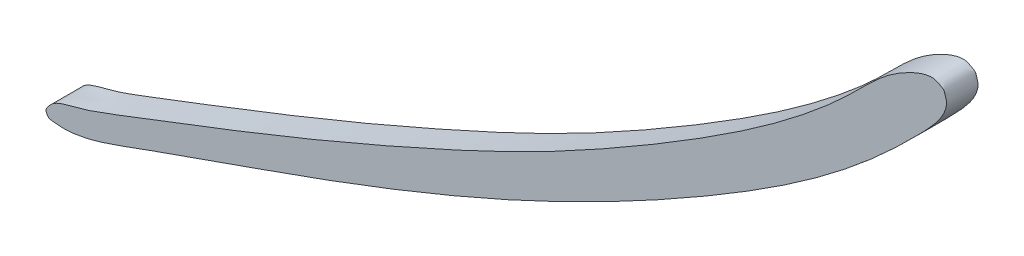
ISO-10303-21;
HEADER;
FILE_DESCRIPTION(('STEP AP214'),'2;1');
FILE_NAME('part.step','',(''),(''),'','','');
FILE_SCHEMA(('AUTOMOTIVE_DESIGN { 1 0 10303 214 1 1 1 1 }'));
ENDSEC;
DATA;
#1=APPLICATION_CONTEXT('core data for automotive mechanical design processes');
#2=APPLICATION_PROTOCOL_DEFINITION('international standard','automotive_design',2000,#1);
#3=PRODUCT_CONTEXT('',#1,'mechanical');
#4=PRODUCT('Part','Part','',(#3));
#5=PRODUCT_RELATED_PRODUCT_CATEGORY('part','',(#4));
#6=PRODUCT_DEFINITION_FORMATION('','',#4);
#7=PRODUCT_DEFINITION_CONTEXT('part definition',#1,'design');
#8=PRODUCT_DEFINITION('design','',#6,#7);
#9=PRODUCT_DEFINITION_SHAPE('','',#8);
#10=(LENGTH_UNIT() NAMED_UNIT(*) SI_UNIT(.MILLI.,.METRE.));
#11=(NAMED_UNIT(*) PLANE_ANGLE_UNIT() SI_UNIT($,.RADIAN.));
#12=(NAMED_UNIT(*) SI_UNIT($,.STERADIAN.) SOLID_ANGLE_UNIT());
#13=UNCERTAINTY_MEASURE_WITH_UNIT(LENGTH_MEASURE(1.E-05),#10,'distance_accuracy_value','');
#14=(GEOMETRIC_REPRESENTATION_CONTEXT(3) GLOBAL_UNCERTAINTY_ASSIGNED_CONTEXT((#13)) GLOBAL_UNIT_ASSIGNED_CONTEXT((#10,
#11,#12)) REPRESENTATION_CONTEXT('',''));
#15=CARTESIAN_POINT('',(0.,0.,0.));
#16=DIRECTION('',(0.,0.,1.));
#17=DIRECTION('',(1.,0.,0.));
#18=AXIS2_PLACEMENT_3D('',#15,#16,#17);
#19=CARTESIAN_POINT('',(102.137930455402,0.,132.));
#20=CARTESIAN_POINT('',(102.037805146897,0.146229636871609,132.));
#21=CARTESIAN_POINT('',(101.890978832327,0.245399337889206,132.));
#22=CARTESIAN_POINT('',(101.591842363803,0.426321827671628,132.));
#23=CARTESIAN_POINT('',(101.436906964679,0.507239635619079,132.));
#24=CARTESIAN_POINT('',(101.131169709521,0.676425166947434,132.));
#25=CARTESIAN_POINT('',(100.979729814353,0.763558383299158,132.));
#26=CARTESIAN_POINT('',(100.670191526747,0.925985241393696,132.));
#27=CARTESIAN_POINT('',(100.512659050345,1.00156543279865,132.));
#28=CARTESIAN_POINT('',(100.19279169691,1.13596357788684,132.));
#29=CARTESIAN_POINT('',(100.029964221238,1.19440802386454,132.));
#30=CARTESIAN_POINT('',(99.6938321131069,1.27960031332769,132.));
#31=CARTESIAN_POINT('',(99.5192867482493,1.30751595835844,132.));
#32=CARTESIAN_POINT('',(98.9952017038134,1.35163922315983,132.));
#33=CARTESIAN_POINT('',(98.6488621361716,1.32995636890433,132.));
#34=CARTESIAN_POINT('',(97.9591578152379,1.23675947162597,132.));
#35=CARTESIAN_POINT('',(97.6156420688588,1.16357030800946,132.));
#36=CARTESIAN_POINT('',(96.9424250187698,0.993989515733939,132.));
#37=CARTESIAN_POINT('',(96.6107898330607,0.896004925311457,132.));
#38=CARTESIAN_POINT('',(95.629072418065,0.567063211778538,132.));
#39=CARTESIAN_POINT('',(94.9909595162237,0.304351643391276,132.));
#40=CARTESIAN_POINT('',(93.730224157236,-0.262167409642695,132.));
#41=CARTESIAN_POINT('',(93.1069309204403,-0.5700460146506,132.));
#42=CARTESIAN_POINT('',(91.8862772052124,-1.22155197350918,132.));
#43=CARTESIAN_POINT('',(91.288815308498,-1.56439449434345,132.));
#44=CARTESIAN_POINT('',(89.5323168720474,-2.64059392407347,132.));
#45=CARTESIAN_POINT('',(88.4111674647103,-3.42427929668611,132.));
#46=CARTESIAN_POINT('',(85.1905606883966,-5.96508296367269,132.));
#47=CARTESIAN_POINT('',(83.2196758821644,-7.89327988453794,132.));
#48=CARTESIAN_POINT('',(80.2816227209656,-10.8086102894227,132.));
#49=CARTESIAN_POINT('',(79.303536538693,-11.7820292721773,132.));
#50=CARTESIAN_POINT('',(77.3272504792528,-13.7027536513072,132.));
#51=CARTESIAN_POINT('',(76.3308315382405,-14.652371234994,132.));
#52=CARTESIAN_POINT('',(73.2979908044276,-17.4446390460552,132.));
#53=CARTESIAN_POINT('',(71.2207642869302,-19.2343125474414,132.));
#54=CARTESIAN_POINT('',(66.9941575476802,-22.719982481008,132.));
#55=CARTESIAN_POINT('',(64.8447463862334,-24.41593874422,132.));
#56=CARTESIAN_POINT('',(60.4924070989655,-27.738370258863,132.));
#57=CARTESIAN_POINT('',(58.2875916053236,-29.3623951428766,132.));
#58=CARTESIAN_POINT('',(53.8221644956033,-32.5380048708967,132.));
#59=CARTESIAN_POINT('',(51.5624798228858,-34.0907931643764,132.));
#60=CARTESIAN_POINT('',(47.0011353790986,-37.1418735306101,132.));
#61=CARTESIAN_POINT('',(44.6996645082014,-38.6404108522355,132.));
#62=CARTESIAN_POINT('',(40.0665419953837,-41.5983018360331,132.));
#63=CARTESIAN_POINT('',(37.7336982495932,-43.0574486570299,132.));
#64=CARTESIAN_POINT('',(30.7020287301212,-47.3800485668496,132.));
#65=CARTESIAN_POINT('',(25.9692023930995,-50.1888838849351,132.));
#66=CARTESIAN_POINT('',(16.4352471657119,-55.6836967105463,132.));
#67=CARTESIAN_POINT('',(11.6337757960862,-58.3688620870521,132.));
#68=CARTESIAN_POINT('',(1.93825840451001,-63.5721497871928,132.));
#69=CARTESIAN_POINT('',(-2.95800771998094,-66.0878140093452,132.));
#70=CARTESIAN_POINT('',(-12.8332296875771,-70.9396891031561,132.));
#71=CARTESIAN_POINT('',(-17.8125414120026,-73.2791313202058,132.));
#72=CARTESIAN_POINT('',(-27.8204521790793,-77.8557844082065,132.));
#73=CARTESIAN_POINT('',(-32.8463826953075,-80.0953712564962,132.));
#74=CARTESIAN_POINT('',(-42.9245884125073,-84.5092348045199,132.));
#75=CARTESIAN_POINT('',(-47.9783899521363,-86.6813656621724,132.));
#76=CARTESIAN_POINT('',(-58.1214542249295,-90.9416686856892,132.));
#77=CARTESIAN_POINT('',(-63.2117605758927,-93.0273699593919,132.));
#78=CARTESIAN_POINT('',(-73.4247918406907,-97.1220176134338,132.));
#79=CARTESIAN_POINT('',(-78.5472909584001,-99.1319466194302,132.));
#80=CARTESIAN_POINT('',(-86.2415697085708,-102.118990082232,132.));
#81=CARTESIAN_POINT('',(-88.808030284617,-103.110276636802,132.));
#82=CARTESIAN_POINT('',(-93.9421547395348,-105.089729417398,132.));
#83=CARTESIAN_POINT('',(-96.5097690716246,-106.078028193418,132.));
#84=CARTESIAN_POINT('',(-101.647460494522,-108.048197191112,132.));
#85=CARTESIAN_POINT('',(-104.217906341169,-109.029128308072,132.));
#86=CARTESIAN_POINT('',(-108.078169493232,-110.488369171663,132.));
#87=CARTESIAN_POINT('',(-109.365071278119,-110.974533748928,132.));
#88=CARTESIAN_POINT('',(-111.942212145945,-111.937395853168,132.));
#89=CARTESIAN_POINT('',(-113.233795751578,-112.410124070405,132.));
#90=CARTESIAN_POINT('',(-115.842182610907,-113.282739507655,132.));
#91=CARTESIAN_POINT('',(-117.159279130296,-113.684281610609,132.));
#92=CARTESIAN_POINT('',(-119.155094663606,-114.213967352643,132.));
#93=CARTESIAN_POINT('',(-119.824074863091,-114.37755071419,132.));
#94=CARTESIAN_POINT('',(-121.152241553405,-114.73899359476,132.));
#95=CARTESIAN_POINT('',(-121.812397812615,-114.935623016085,132.));
#96=CARTESIAN_POINT('',(-122.779603125193,-115.304539606871,132.));
#97=CARTESIAN_POINT('',(-123.095312408866,-115.440135550305,132.));
#98=CARTESIAN_POINT('',(-123.703611303655,-115.754937066527,132.));
#99=CARTESIAN_POINT('',(-123.996258155954,-115.93403466777,132.));
#100=CARTESIAN_POINT('',(-124.54484346904,-116.361471307138,132.));
#101=CARTESIAN_POINT('',(-124.786731806904,-116.604824285959,132.));
#102=CARTESIAN_POINT('',(-125.122752976249,-116.99273074378,132.));
#103=CARTESIAN_POINT('',(-125.229289290044,-117.126859326399,132.));
#104=CARTESIAN_POINT('',(-125.436894899473,-117.399939635806,132.));
#105=CARTESIAN_POINT('',(-125.540547611726,-117.536612205943,132.));
#106=CARTESIAN_POINT('',(-125.689486009442,-117.747391409195,132.));
#107=CARTESIAN_POINT('',(-125.737719979883,-117.819079015593,132.));
#108=CARTESIAN_POINT('',(-125.827352226952,-117.965883936789,132.));
#109=CARTESIAN_POINT('',(-125.868650585888,-118.041229097688,132.));
#110=CARTESIAN_POINT('',(-125.933071449544,-118.20195711146,132.));
#111=CARTESIAN_POINT('',(-125.954921717384,-118.285483740978,132.));
#112=CARTESIAN_POINT('',(-125.966168559822,-118.457650362435,132.));
#113=CARTESIAN_POINT('',(-125.956554251801,-118.54463905097,132.));
#114=CARTESIAN_POINT('',(-125.918957680488,-118.713195842022,132.));
#115=CARTESIAN_POINT('',(-125.890724928659,-118.795432740867,132.));
#116=CARTESIAN_POINT('',(-125.826676335791,-118.954122918201,132.));
#117=CARTESIAN_POINT('',(-125.791089398784,-119.031695103422,132.));
#118=CARTESIAN_POINT('',(-125.677408481627,-119.260967954965,132.));
#119=CARTESIAN_POINT('',(-125.594990009522,-119.411415158988,132.));
#120=CARTESIAN_POINT('',(-125.439448220367,-119.618406885828,132.));
#121=CARTESIAN_POINT('',(-125.382455949172,-119.682190299005,132.));
#122=CARTESIAN_POINT('',(-125.250634824458,-119.791681956291,132.));
#123=CARTESIAN_POINT('',(-125.175475626558,-119.837900936341,132.));
#124=CARTESIAN_POINT('',(-125.017300088967,-119.903327448119,132.));
#125=CARTESIAN_POINT('',(-124.932105037599,-119.923115366531,132.));
#126=CARTESIAN_POINT('',(-124.761503785991,-119.949297902801,132.));
#127=CARTESIAN_POINT('',(-124.675670954152,-119.956390590639,132.));
#128=CARTESIAN_POINT('',(-124.417731670189,-119.97270045629,132.));
#129=CARTESIAN_POINT('',(-124.245443785571,-119.979872679115,132.));
#130=CARTESIAN_POINT('',(-123.902047546155,-120.007511796147,132.));
#131=CARTESIAN_POINT('',(-123.730718808403,-120.025011964971,132.));
#132=CARTESIAN_POINT('',(-123.216659307915,-120.080464884912,132.));
#133=CARTESIAN_POINT('',(-122.873911994648,-120.124101669157,132.));
#134=CARTESIAN_POINT('',(-122.188578207543,-120.185203567199,132.));
#135=CARTESIAN_POINT('',(-121.84599795949,-120.20165562581,132.));
#136=CARTESIAN_POINT('',(-120.818519801551,-120.208283970037,132.));
#137=CARTESIAN_POINT('',(-120.133840537175,-120.162882423307,132.));
#138=CARTESIAN_POINT('',(-118.764789471065,-120.02204924038,132.));
#139=CARTESIAN_POINT('',(-118.079873592481,-119.926616340941,132.));
#140=CARTESIAN_POINT('',(-116.727290625528,-119.693972886936,132.));
#141=CARTESIAN_POINT('',(-116.057392964513,-119.556324609868,132.));
#142=CARTESIAN_POINT('',(-114.063949251599,-119.08918045189,132.));
#143=CARTESIAN_POINT('',(-112.756116084513,-118.707274353669,132.));
#144=CARTESIAN_POINT('',(-110.158433259272,-117.883478289072,132.));
#145=CARTESIAN_POINT('',(-108.868782818179,-117.440923835579,132.));
#146=CARTESIAN_POINT('',(-105.010998169228,-116.07601411104,132.));
#147=CARTESIAN_POINT('',(-102.45135272545,-115.125769977328,132.));
#148=CARTESIAN_POINT('',(-97.3231724797735,-113.253017159608,132.));
#149=CARTESIAN_POINT('',(-94.7559603465308,-112.325131283396,132.));
#150=CARTESIAN_POINT('',(-87.0410494981809,-109.578820463927,132.));
#151=CARTESIAN_POINT('',(-81.883597119722,-107.787966068635,132.));
#152=CARTESIAN_POINT('',(-71.5753261380952,-104.187785749704,132.));
#153=CARTESIAN_POINT('',(-66.424813948383,-102.377605390337,132.));
#154=CARTESIAN_POINT('',(-51.0150719978304,-96.8306743008907,132.));
#155=CARTESIAN_POINT('',(-40.7968285777669,-92.9748600967594,132.));
#156=CARTESIAN_POINT('',(-25.6207823234757,-86.8227095175091,132.));
#157=CARTESIAN_POINT('',(-20.5857057499092,-84.7108209349476,132.));
#158=CARTESIAN_POINT('',(-10.5744784748642,-80.3515174601029,132.));
#159=CARTESIAN_POINT('',(-5.60027302905004,-78.1044710870705,132.));
#160=CARTESIAN_POINT('',(9.21311389520294,-71.1289511870604,132.));
#161=CARTESIAN_POINT('',(18.949532507196,-66.1655036698025,132.));
#162=CARTESIAN_POINT('',(33.3143672263242,-58.3021577040219,132.));
#163=CARTESIAN_POINT('',(38.0598795047546,-55.6156202684256,132.));
#164=CARTESIAN_POINT('',(47.4533006537206,-50.093234565563,132.));
#165=CARTESIAN_POINT('',(52.1018742118062,-47.2584031178215,132.));
#166=CARTESIAN_POINT('',(61.2577818191804,-41.3726761629155,132.));
#167=CARTESIAN_POINT('',(65.7648809569383,-38.3214212949792,132.));
#168=CARTESIAN_POINT('',(72.3630919267092,-33.4960465058827,132.));
#169=CARTESIAN_POINT('',(74.5352010017027,-31.8458337921994,132.));
#170=CARTESIAN_POINT('',(78.817594632654,-28.4508310283035,132.));
#171=CARTESIAN_POINT('',(80.929476931131,-26.7045683788321,132.));
#172=CARTESIAN_POINT('',(87.1560148791327,-21.3259591304857,132.));
#173=CARTESIAN_POINT('',(91.1498868829552,-17.561893666817,132.));
#174=CARTESIAN_POINT('',(95.9755362404891,-12.6897658358867,132.));
#175=CARTESIAN_POINT('',(96.9322408166502,-11.707180948403,132.));
#176=CARTESIAN_POINT('',(98.3346540111256,-10.202219862829,132.));
#177=CARTESIAN_POINT('',(98.795526266484,-9.69383559383015,132.));
#178=CARTESIAN_POINT('',(99.6918304332566,-8.65724626232659,132.));
#179=CARTESIAN_POINT('',(100.128821983003,-8.1300002174115,132.));
#180=CARTESIAN_POINT('',(100.953322297159,-7.03582013524291,132.));
#181=CARTESIAN_POINT('',(101.342481855185,-6.46606719561971,132.));
#182=CARTESIAN_POINT('',(101.851882112656,-5.57529374339316,132.));
#183=CARTESIAN_POINT('',(102.009204424916,-5.27199992193701,132.));
#184=CARTESIAN_POINT('',(102.290827421937,-4.64855623613289,132.));
#185=CARTESIAN_POINT('',(102.415285248998,-4.32681059107333,132.));
#186=CARTESIAN_POINT('',(102.623407975458,-3.67067133913848,132.));
#187=CARTESIAN_POINT('',(102.706704466913,-3.33794584714221,132.));
#188=CARTESIAN_POINT('',(102.77826367521,-2.82688759204031,132.));
#189=CARTESIAN_POINT('',(102.792929541616,-2.65333006194103,132.));
#190=CARTESIAN_POINT('',(102.797741448038,-2.31028933307934,132.));
#191=CARTESIAN_POINT('',(102.788458920649,-2.14011290008352,132.));
#192=CARTESIAN_POINT('',(102.711491251339,-1.63523138642102,132.));
#193=CARTESIAN_POINT('',(102.592766575456,-1.30671888301107,132.));
#194=CARTESIAN_POINT('',(102.423365853362,-0.816297899759952,132.));
#195=CARTESIAN_POINT('',(102.374013222676,-0.650368416989375,132.));
#196=CARTESIAN_POINT('',(102.302841657475,-0.400487835664663,132.));
#197=CARTESIAN_POINT('',(102.279823890325,-0.316950569649881,132.));
#198=CARTESIAN_POINT('',(102.222873165123,-0.15364392067302,132.));
#199=CARTESIAN_POINT('',(102.187993109655,-0.0731148184357954,132.));
#200=CARTESIAN_POINT('',(102.137930455402,0.,132.));
#201=B_SPLINE_CURVE_WITH_KNOTS('',3,(#19,#20,#21,#22,#23,#24,#25,#26,#27,#28,#29,#30,#31,#32,
#33,#34,#35,#36,#37,#38,#39,#40,#41,#42,#43,#44,#45,#46,#47,#48,#49,#50,#51,#52,#53,#54,#55,#56,
#57,#58,#59,#60,#61,#62,#63,#64,#65,#66,#67,#68,#69,#70,#71,#72,#73,#74,#75,#76,#77,#78,#79,#80,
#81,#82,#83,#84,#85,#86,#87,#88,#89,#90,#91,#92,#93,#94,#95,#96,#97,#98,#99,#100,#101,#102,#103,
#104,#105,#106,#107,#108,#109,#110,#111,#112,#113,#114,#115,#116,#117,#118,#119,#120,#121,#122,
#123,#124,#125,#126,#127,#128,#129,#130,#131,#132,#133,#134,#135,#136,#137,#138,#139,#140,#141,
#142,#143,#144,#145,#146,#147,#148,#149,#150,#151,#152,#153,#154,#155,#156,#157,#158,#159,#160,
#161,#162,#163,#164,#165,#166,#167,#168,#169,#170,#171,#172,#173,#174,#175,#176,#177,#178,#179,
#180,#181,#182,#183,#184,#185,#186,#187,#188,#189,#190,#191,#192,#193,#194,#195,#196,#197,#198,
#199,#200),.UNSPECIFIED.,.T.,.F.,(4,2,2,2,2,2,2,2,2,2,2,2,2,2,2,2,2,2,2,2,2,2,2,2,2,2,2,2,2,2,2,
2,2,2,2,2,2,2,2,2,2,2,2,2,2,2,2,2,2,2,2,2,2,2,2,2,2,2,2,2,2,2,2,2,2,2,2,2,2,2,2,2,2,2,2,2,2,2,2,
2,2,2,2,2,2,2,2,2,2,2,4),(0.,0.000976562499999827,0.00195312499999965,0.00292968749999948,
0.00390624999999931,0.00488281249999913,0.00585937499999896,0.00781249999999869,
0.00976562499999842,0.0117187499999982,0.0156249999999976,0.0195312499999971,0.0234374999999965,
0.0312499999999954,0.0468749999999933,0.0546874999999923,0.0624999999999913,0.0781249999999892,
0.0937499999999871,0.109374999999985,0.124999999999983,0.140624999999981,0.156249999999979,
0.187499999999974,0.21874999999997,0.249999999999966,0.281249999999962,0.312499999999958,
0.343749999999953,0.374999999999949,0.406249999999945,0.421874999999943,0.437499999999941,
0.453124999999939,0.460937499999938,0.468749999999937,0.476562499999936,0.480468749999935,
0.484374999999935,0.486328124999935,0.488281249999934,0.490234374999934,0.491210937499934,
0.492187499999934,0.492675781249934,0.493164062499934,0.493652343749934,0.494140624999934,
0.494628906249934,0.495117187499934,0.496093749999934,0.496582031249934,0.497070312499934,
0.497558593749934,0.498046874999934,0.499023437499934,0.499999999999934,0.501953124999934,
0.503906249999934,0.507812499999935,0.511718749999935,0.515624999999936,0.523437499999937,
0.531249999999938,0.54687499999994,0.562499999999942,0.593749999999946,0.62499999999995,
0.687499999999959,0.718749999999963,0.749999999999967,0.812499999999975,0.843749999999979,
0.874999999999983,0.906249999999988,0.92187499999999,0.937499999999992,0.968749999999996,
0.976562499999997,0.980468749999997,0.984374999999998,0.988281249999999,0.990234374999999,
0.992187499999999,0.994140624999999,0.995117187499999,0.996093749999999,0.998046875,
0.9990234375,0.99951171875,1.),.UNSPECIFIED.);
#202=DIRECTION('',(0.,0.,-1.));
#203=VECTOR('',#202,1.);
#204=SURFACE_OF_LINEAR_EXTRUSION('',#201,#203);
#205=CARTESIAN_POINT('',(102.137930455402,0.,132.));
#206=CARTESIAN_POINT('',(102.187993109655,-0.0731148184357954,132.));
#207=CARTESIAN_POINT('',(102.222873165123,-0.15364392067302,132.));
#208=CARTESIAN_POINT('',(102.279823890325,-0.316950569649881,132.));
#209=CARTESIAN_POINT('',(102.302841657475,-0.400487835664663,132.));
#210=CARTESIAN_POINT('',(102.374013222676,-0.650368416989375,132.));
#211=CARTESIAN_POINT('',(102.423365853362,-0.816297899759952,132.));
#212=CARTESIAN_POINT('',(102.592766575456,-1.30671888301107,132.));
#213=CARTESIAN_POINT('',(102.711491251339,-1.63523138642102,132.));
#214=CARTESIAN_POINT('',(102.788458920649,-2.14011290008352,132.));
#215=CARTESIAN_POINT('',(102.797741448038,-2.31028933307934,132.));
#216=CARTESIAN_POINT('',(102.792929541616,-2.65333006194103,132.));
#217=CARTESIAN_POINT('',(102.77826367521,-2.82688759204031,132.));
#218=CARTESIAN_POINT('',(102.706704466913,-3.33794584714221,132.));
#219=CARTESIAN_POINT('',(102.623407975458,-3.67067133913848,132.));
#220=CARTESIAN_POINT('',(102.415285248998,-4.32681059107333,132.));
#221=CARTESIAN_POINT('',(102.290827421937,-4.64855623613289,132.));
#222=CARTESIAN_POINT('',(102.009204424916,-5.27199992193701,132.));
#223=CARTESIAN_POINT('',(101.851882112656,-5.57529374339316,132.));
#224=CARTESIAN_POINT('',(101.342481855185,-6.46606719561971,132.));
#225=CARTESIAN_POINT('',(100.953322297159,-7.03582013524291,132.));
#226=CARTESIAN_POINT('',(100.128821983003,-8.1300002174115,132.));
#227=CARTESIAN_POINT('',(99.6918304332566,-8.65724626232659,132.));
#228=CARTESIAN_POINT('',(98.795526266484,-9.69383559383015,132.));
#229=CARTESIAN_POINT('',(98.3346540111256,-10.202219862829,132.));
#230=CARTESIAN_POINT('',(96.9322408166502,-11.707180948403,132.));
#231=CARTESIAN_POINT('',(95.9755362404891,-12.6897658358867,132.));
#232=CARTESIAN_POINT('',(91.1498868829552,-17.561893666817,132.));
#233=CARTESIAN_POINT('',(87.1560148791327,-21.3259591304857,132.));
#234=CARTESIAN_POINT('',(80.929476931131,-26.7045683788321,132.));
#235=CARTESIAN_POINT('',(78.817594632654,-28.4508310283035,132.));
#236=CARTESIAN_POINT('',(74.5352010017027,-31.8458337921994,132.));
#237=CARTESIAN_POINT('',(72.3630919267092,-33.4960465058827,132.));
#238=CARTESIAN_POINT('',(65.7648809569383,-38.3214212949792,132.));
#239=CARTESIAN_POINT('',(61.2577818191804,-41.3726761629155,132.));
#240=CARTESIAN_POINT('',(52.1018742118062,-47.2584031178215,132.));
#241=CARTESIAN_POINT('',(47.4533006537206,-50.093234565563,132.));
#242=CARTESIAN_POINT('',(38.0598795047546,-55.6156202684256,132.));
#243=CARTESIAN_POINT('',(33.3143672263242,-58.3021577040219,132.));
#244=CARTESIAN_POINT('',(18.949532507196,-66.1655036698025,132.));
#245=CARTESIAN_POINT('',(9.21311389520294,-71.1289511870604,132.));
#246=CARTESIAN_POINT('',(-5.60027302905004,-78.1044710870705,132.));
#247=CARTESIAN_POINT('',(-10.5744784748642,-80.3515174601029,132.));
#248=CARTESIAN_POINT('',(-20.5857057499092,-84.7108209349476,132.));
#249=CARTESIAN_POINT('',(-25.6207823234757,-86.8227095175091,132.));
#250=CARTESIAN_POINT('',(-40.7968285777669,-92.9748600967594,132.));
#251=CARTESIAN_POINT('',(-51.0150719978304,-96.8306743008907,132.));
#252=CARTESIAN_POINT('',(-66.424813948383,-102.377605390337,132.));
#253=CARTESIAN_POINT('',(-71.5753261380952,-104.187785749704,132.));
#254=CARTESIAN_POINT('',(-81.883597119722,-107.787966068635,132.));
#255=CARTESIAN_POINT('',(-87.0410494981809,-109.578820463927,132.));
#256=CARTESIAN_POINT('',(-94.7559603465308,-112.325131283396,132.));
#257=CARTESIAN_POINT('',(-97.3231724797735,-113.253017159608,132.));
#258=CARTESIAN_POINT('',(-102.45135272545,-115.125769977328,132.));
#259=CARTESIAN_POINT('',(-105.010998169228,-116.07601411104,132.));
#260=CARTESIAN_POINT('',(-108.868782818179,-117.440923835579,132.));
#261=CARTESIAN_POINT('',(-110.158433259272,-117.883478289072,132.));
#262=CARTESIAN_POINT('',(-112.756116084513,-118.707274353669,132.));
#263=CARTESIAN_POINT('',(-114.063949251599,-119.08918045189,132.));
#264=CARTESIAN_POINT('',(-116.057392964513,-119.556324609868,132.));
#265=CARTESIAN_POINT('',(-116.727290625528,-119.693972886936,132.));
#266=CARTESIAN_POINT('',(-118.079873592481,-119.926616340941,132.));
#267=CARTESIAN_POINT('',(-118.764789471065,-120.02204924038,132.));
#268=CARTESIAN_POINT('',(-120.133840537175,-120.162882423307,132.));
#269=CARTESIAN_POINT('',(-120.818519801551,-120.208283970037,132.));
#270=CARTESIAN_POINT('',(-121.84599795949,-120.20165562581,132.));
#271=CARTESIAN_POINT('',(-122.188578207543,-120.185203567199,132.));
#272=CARTESIAN_POINT('',(-122.873911994648,-120.124101669157,132.));
#273=CARTESIAN_POINT('',(-123.216659307915,-120.080464884912,132.));
#274=CARTESIAN_POINT('',(-123.730718808403,-120.025011964971,132.));
#275=CARTESIAN_POINT('',(-123.902047546155,-120.007511796147,132.));
#276=CARTESIAN_POINT('',(-124.245443785571,-119.979872679115,132.));
#277=CARTESIAN_POINT('',(-124.417731670189,-119.97270045629,132.));
#278=CARTESIAN_POINT('',(-124.675670954152,-119.956390590639,132.));
#279=CARTESIAN_POINT('',(-124.761503785991,-119.949297902801,132.));
#280=CARTESIAN_POINT('',(-124.932105037599,-119.923115366531,132.));
#281=CARTESIAN_POINT('',(-125.017300088967,-119.903327448119,132.));
#282=CARTESIAN_POINT('',(-125.175475626558,-119.837900936341,132.));
#283=CARTESIAN_POINT('',(-125.250634824458,-119.791681956291,132.));
#284=CARTESIAN_POINT('',(-125.382455949172,-119.682190299005,132.));
#285=CARTESIAN_POINT('',(-125.439448220367,-119.618406885828,132.));
#286=CARTESIAN_POINT('',(-125.594990009522,-119.411415158988,132.));
#287=CARTESIAN_POINT('',(-125.677408481627,-119.260967954965,132.));
#288=CARTESIAN_POINT('',(-125.791089398784,-119.031695103422,132.));
#289=CARTESIAN_POINT('',(-125.826676335791,-118.954122918201,132.));
#290=CARTESIAN_POINT('',(-125.890724928659,-118.795432740867,132.));
#291=CARTESIAN_POINT('',(-125.918957680488,-118.713195842022,132.));
#292=CARTESIAN_POINT('',(-125.956554251801,-118.54463905097,132.));
#293=CARTESIAN_POINT('',(-125.966168559822,-118.457650362435,132.));
#294=CARTESIAN_POINT('',(-125.954921717384,-118.285483740978,132.));
#295=CARTESIAN_POINT('',(-125.933071449544,-118.20195711146,132.));
#296=CARTESIAN_POINT('',(-125.868650585888,-118.041229097688,132.));
#297=CARTESIAN_POINT('',(-125.827352226952,-117.965883936789,132.));
#298=CARTESIAN_POINT('',(-125.737719979883,-117.819079015593,132.));
#299=CARTESIAN_POINT('',(-125.689486009442,-117.747391409195,132.));
#300=CARTESIAN_POINT('',(-125.540547611726,-117.536612205943,132.));
#301=CARTESIAN_POINT('',(-125.436894899473,-117.399939635806,132.));
#302=CARTESIAN_POINT('',(-125.229289290044,-117.126859326399,132.));
#303=CARTESIAN_POINT('',(-125.122752976249,-116.99273074378,132.));
#304=CARTESIAN_POINT('',(-124.786731806904,-116.604824285959,132.));
#305=CARTESIAN_POINT('',(-124.54484346904,-116.361471307138,132.));
#306=CARTESIAN_POINT('',(-123.996258155954,-115.93403466777,132.));
#307=CARTESIAN_POINT('',(-123.703611303655,-115.754937066527,132.));
#308=CARTESIAN_POINT('',(-123.095312408866,-115.440135550305,132.));
#309=CARTESIAN_POINT('',(-122.779603125193,-115.304539606871,132.));
#310=CARTESIAN_POINT('',(-121.812397812615,-114.935623016085,132.));
#311=CARTESIAN_POINT('',(-121.152241553405,-114.73899359476,132.));
#312=CARTESIAN_POINT('',(-119.824074863091,-114.37755071419,132.));
#313=CARTESIAN_POINT('',(-119.155094663606,-114.213967352643,132.));
#314=CARTESIAN_POINT('',(-117.159279130296,-113.684281610609,132.));
#315=CARTESIAN_POINT('',(-115.842182610907,-113.282739507655,132.));
#316=CARTESIAN_POINT('',(-113.233795751578,-112.410124070405,132.));
#317=CARTESIAN_POINT('',(-111.942212145945,-111.937395853168,132.));
#318=CARTESIAN_POINT('',(-109.365071278119,-110.974533748928,132.));
#319=CARTESIAN_POINT('',(-108.078169493232,-110.488369171663,132.));
#320=CARTESIAN_POINT('',(-104.217906341169,-109.029128308072,132.));
#321=CARTESIAN_POINT('',(-101.647460494522,-108.048197191112,132.));
#322=CARTESIAN_POINT('',(-96.5097690716246,-106.078028193418,132.));
#323=CARTESIAN_POINT('',(-93.9421547395348,-105.089729417398,132.));
#324=CARTESIAN_POINT('',(-88.808030284617,-103.110276636802,132.));
#325=CARTESIAN_POINT('',(-86.2415697085708,-102.118990082232,132.));
#326=CARTESIAN_POINT('',(-78.5472909584001,-99.1319466194302,132.));
#327=CARTESIAN_POINT('',(-73.4247918406907,-97.1220176134338,132.));
#328=CARTESIAN_POINT('',(-63.2117605758927,-93.0273699593919,132.));
#329=CARTESIAN_POINT('',(-58.1214542249295,-90.9416686856892,132.));
#330=CARTESIAN_POINT('',(-47.9783899521363,-86.6813656621724,132.));
#331=CARTESIAN_POINT('',(-42.9245884125073,-84.5092348045199,132.));
#332=CARTESIAN_POINT('',(-32.8463826953075,-80.0953712564962,132.));
#333=CARTESIAN_POINT('',(-27.8204521790793,-77.8557844082065,132.));
#334=CARTESIAN_POINT('',(-17.8125414120026,-73.2791313202058,132.));
#335=CARTESIAN_POINT('',(-12.8332296875771,-70.9396891031561,132.));
#336=CARTESIAN_POINT('',(-2.95800771998094,-66.0878140093452,132.));
#337=CARTESIAN_POINT('',(1.93825840451001,-63.5721497871928,132.));
#338=CARTESIAN_POINT('',(11.6337757960862,-58.3688620870521,132.));
#339=CARTESIAN_POINT('',(16.4352471657119,-55.6836967105463,132.));
#340=CARTESIAN_POINT('',(25.9692023930995,-50.1888838849351,132.));
#341=CARTESIAN_POINT('',(30.7020287301212,-47.3800485668496,132.));
#342=CARTESIAN_POINT('',(37.7336982495932,-43.0574486570299,132.));
#343=CARTESIAN_POINT('',(40.0665419953837,-41.5983018360331,132.));
#344=CARTESIAN_POINT('',(44.6996645082014,-38.6404108522355,132.));
#345=CARTESIAN_POINT('',(47.0011353790986,-37.1418735306101,132.));
#346=CARTESIAN_POINT('',(51.5624798228858,-34.0907931643764,132.));
#347=CARTESIAN_POINT('',(53.8221644956033,-32.5380048708967,132.));
#348=CARTESIAN_POINT('',(58.2875916053236,-29.3623951428766,132.));
#349=CARTESIAN_POINT('',(60.4924070989655,-27.738370258863,132.));
#350=CARTESIAN_POINT('',(64.8447463862334,-24.41593874422,132.));
#351=CARTESIAN_POINT('',(66.9941575476802,-22.719982481008,132.));
#352=CARTESIAN_POINT('',(71.2207642869302,-19.2343125474414,132.));
#353=CARTESIAN_POINT('',(73.2979908044276,-17.4446390460552,132.));
#354=CARTESIAN_POINT('',(76.3308315382405,-14.652371234994,132.));
#355=CARTESIAN_POINT('',(77.3272504792528,-13.7027536513072,132.));
#356=CARTESIAN_POINT('',(79.303536538693,-11.7820292721773,132.));
#357=CARTESIAN_POINT('',(80.2816227209656,-10.8086102894227,132.));
#358=CARTESIAN_POINT('',(83.2196758821644,-7.89327988453794,132.));
#359=CARTESIAN_POINT('',(85.1905606883966,-5.96508296367269,132.));
#360=CARTESIAN_POINT('',(88.4111674647103,-3.42427929668611,132.));
#361=CARTESIAN_POINT('',(89.5323168720474,-2.64059392407347,132.));
#362=CARTESIAN_POINT('',(91.288815308498,-1.56439449434345,132.));
#363=CARTESIAN_POINT('',(91.8862772052124,-1.22155197350918,132.));
#364=CARTESIAN_POINT('',(93.1069309204403,-0.5700460146506,132.));
#365=CARTESIAN_POINT('',(93.730224157236,-0.262167409642695,132.));
#366=CARTESIAN_POINT('',(94.9909595162237,0.304351643391276,132.));
#367=CARTESIAN_POINT('',(95.629072418065,0.567063211778538,132.));
#368=CARTESIAN_POINT('',(96.6107898330607,0.896004925311457,132.));
#369=CARTESIAN_POINT('',(96.9424250187698,0.993989515733939,132.));
#370=CARTESIAN_POINT('',(97.6156420688588,1.16357030800946,132.));
#371=CARTESIAN_POINT('',(97.9591578152379,1.23675947162597,132.));
#372=CARTESIAN_POINT('',(98.6488621361716,1.32995636890433,132.));
#373=CARTESIAN_POINT('',(98.9952017038134,1.35163922315983,132.));
#374=CARTESIAN_POINT('',(99.5192867482493,1.30751595835844,132.));
#375=CARTESIAN_POINT('',(99.6938321131069,1.27960031332769,132.));
#376=CARTESIAN_POINT('',(100.029964221238,1.19440802386454,132.));
#377=CARTESIAN_POINT('',(100.19279169691,1.13596357788684,132.));
#378=CARTESIAN_POINT('',(100.512659050345,1.00156543279865,132.));
#379=CARTESIAN_POINT('',(100.670191526747,0.925985241393696,132.));
#380=CARTESIAN_POINT('',(100.979729814353,0.763558383299158,132.));
#381=CARTESIAN_POINT('',(101.131169709521,0.676425166947434,132.));
#382=CARTESIAN_POINT('',(101.436906964679,0.507239635619079,132.));
#383=CARTESIAN_POINT('',(101.591842363803,0.426321827671628,132.));
#384=CARTESIAN_POINT('',(101.890978832327,0.245399337889206,132.));
#385=CARTESIAN_POINT('',(102.037805146897,0.146229636871609,132.));
#386=CARTESIAN_POINT('',(102.137930455402,0.,132.));
#387=B_SPLINE_CURVE_WITH_KNOTS('',3,(#205,#206,#207,#208,#209,#210,#211,#212,#213,#214,#215,
#216,#217,#218,#219,#220,#221,#222,#223,#224,#225,#226,#227,#228,#229,#230,#231,#232,#233,#234,
#235,#236,#237,#238,#239,#240,#241,#242,#243,#244,#245,#246,#247,#248,#249,#250,#251,#252,#253,
#254,#255,#256,#257,#258,#259,#260,#261,#262,#263,#264,#265,#266,#267,#268,#269,#270,#271,#272,
#273,#274,#275,#276,#277,#278,#279,#280,#281,#282,#283,#284,#285,#286,#287,#288,#289,#290,#291,
#292,#293,#294,#295,#296,#297,#298,#299,#300,#301,#302,#303,#304,#305,#306,#307,#308,#309,#310,
#311,#312,#313,#314,#315,#316,#317,#318,#319,#320,#321,#322,#323,#324,#325,#326,#327,#328,#329,
#330,#331,#332,#333,#334,#335,#336,#337,#338,#339,#340,#341,#342,#343,#344,#345,#346,#347,#348,
#349,#350,#351,#352,#353,#354,#355,#356,#357,#358,#359,#360,#361,#362,#363,#364,#365,#366,#367,
#368,#369,#370,#371,#372,#373,#374,#375,#376,#377,#378,#379,#380,#381,#382,#383,#384,#385,#386),
.UNSPECIFIED.,.T.,.F.,(4,2,2,2,2,2,2,2,2,2,2,2,2,2,2,2,2,2,2,2,2,2,2,2,2,2,2,2,2,2,2,2,2,2,2,2,
2,2,2,2,2,2,2,2,2,2,2,2,2,2,2,2,2,2,2,2,2,2,2,2,2,2,2,2,2,2,2,2,2,2,2,2,2,2,2,2,2,2,2,2,2,2,2,2,
2,2,2,2,2,2,4),(0.,0.00048828125,0.0009765625,0.00195312500000022,0.00390625000000056,
0.00488281250000067,0.00585937500000089,0.00781250000000111,0.00976562500000122,
0.0117187500000014,0.015625000000002,0.0195312500000026,0.0234375000000031,0.0312500000000041,
0.0625000000000082,0.0781250000000103,0.0937500000000124,0.125000000000017,0.156250000000021,
0.187500000000025,0.250000000000033,0.281250000000037,0.312500000000041,0.37500000000005,
0.406250000000054,0.437500000000058,0.45312500000006,0.468750000000062,0.476562500000063,
0.484375000000064,0.488281250000065,0.492187500000065,0.496093750000066,0.498046875000066,
0.500000000000066,0.500976562500066,0.501953125000066,0.502441406250066,0.502929687500066,
0.503417968750066,0.503906250000066,0.504882812500066,0.505371093750066,0.505859375000066,
0.506347656250066,0.506835937500066,0.507324218750066,0.507812500000066,0.508789062500066,
0.509765625000066,0.511718750000066,0.513671875000065,0.515625000000065,0.519531250000065,
0.523437500000064,0.531250000000063,0.539062500000062,0.546875000000061,0.562500000000059,
0.578125000000057,0.593750000000055,0.625000000000051,0.656250000000047,0.687500000000042,
0.718750000000038,0.750000000000034,0.78125000000003,0.812500000000026,0.843750000000021,
0.859375000000019,0.875000000000017,0.890625000000015,0.906250000000013,0.921875000000011,
0.937500000000009,0.945312500000008,0.953125000000007,0.968750000000005,0.976562500000003,
0.980468750000003,0.984375000000002,0.988281250000002,0.990234375000002,0.992187500000001,
0.994140625000001,0.995117187500001,0.996093750000001,0.997070312500001,0.998046875,
0.9990234375,1.),.UNSPECIFIED.);
#388=CARTESIAN_POINT('',(102.137930455402,0.,132.));
#389=VERTEX_POINT('',#388);
#390=EDGE_CURVE('E10',#389,#389,#387,.F.);
#391=ORIENTED_EDGE('',*,*,#390,.F.);
#392=EDGE_LOOP('',(#391));
#393=FACE_BOUND('',#392,.T.);
#394=CARTESIAN_POINT('',(102.137930455402,0.,124.));
#395=CARTESIAN_POINT('',(102.037805146897,0.146229636871609,124.));
#396=CARTESIAN_POINT('',(101.890978832327,0.245399337889206,124.));
#397=CARTESIAN_POINT('',(101.591842363803,0.426321827671628,124.));
#398=CARTESIAN_POINT('',(101.436906964679,0.507239635619079,124.));
#399=CARTESIAN_POINT('',(101.131169709521,0.676425166947434,124.));
#400=CARTESIAN_POINT('',(100.979729814353,0.763558383299158,124.));
#401=CARTESIAN_POINT('',(100.670191526747,0.925985241393696,124.));
#402=CARTESIAN_POINT('',(100.512659050345,1.00156543279865,124.));
#403=CARTESIAN_POINT('',(100.19279169691,1.13596357788684,124.));
#404=CARTESIAN_POINT('',(100.029964221238,1.19440802386454,124.));
#405=CARTESIAN_POINT('',(99.6938321131069,1.27960031332769,124.));
#406=CARTESIAN_POINT('',(99.5192867482493,1.30751595835844,124.));
#407=CARTESIAN_POINT('',(98.9952017038134,1.35163922315983,124.));
#408=CARTESIAN_POINT('',(98.6488621361716,1.32995636890433,124.));
#409=CARTESIAN_POINT('',(97.9591578152379,1.23675947162597,124.));
#410=CARTESIAN_POINT('',(97.6156420688588,1.16357030800946,124.));
#411=CARTESIAN_POINT('',(96.9424250187698,0.993989515733939,124.));
#412=CARTESIAN_POINT('',(96.6107898330607,0.896004925311457,124.));
#413=CARTESIAN_POINT('',(95.629072418065,0.567063211778538,124.));
#414=CARTESIAN_POINT('',(94.9909595162237,0.304351643391276,124.));
#415=CARTESIAN_POINT('',(93.730224157236,-0.262167409642695,124.));
#416=CARTESIAN_POINT('',(93.1069309204403,-0.5700460146506,124.));
#417=CARTESIAN_POINT('',(91.8862772052124,-1.22155197350918,124.));
#418=CARTESIAN_POINT('',(91.288815308498,-1.56439449434345,124.));
#419=CARTESIAN_POINT('',(89.5323168720474,-2.64059392407347,124.));
#420=CARTESIAN_POINT('',(88.4111674647103,-3.42427929668611,124.));
#421=CARTESIAN_POINT('',(85.1905606883966,-5.96508296367269,124.));
#422=CARTESIAN_POINT('',(83.2196758821644,-7.89327988453794,124.));
#423=CARTESIAN_POINT('',(80.2816227209656,-10.8086102894227,124.));
#424=CARTESIAN_POINT('',(79.303536538693,-11.7820292721773,124.));
#425=CARTESIAN_POINT('',(77.3272504792528,-13.7027536513072,124.));
#426=CARTESIAN_POINT('',(76.3308315382405,-14.652371234994,124.));
#427=CARTESIAN_POINT('',(73.2979908044276,-17.4446390460552,124.));
#428=CARTESIAN_POINT('',(71.2207642869302,-19.2343125474414,124.));
#429=CARTESIAN_POINT('',(66.9941575476802,-22.719982481008,124.));
#430=CARTESIAN_POINT('',(64.8447463862334,-24.41593874422,124.));
#431=CARTESIAN_POINT('',(60.4924070989655,-27.738370258863,124.));
#432=CARTESIAN_POINT('',(58.2875916053236,-29.3623951428766,124.));
#433=CARTESIAN_POINT('',(53.8221644956033,-32.5380048708967,124.));
#434=CARTESIAN_POINT('',(51.5624798228858,-34.0907931643764,124.));
#435=CARTESIAN_POINT('',(47.0011353790986,-37.1418735306101,124.));
#436=CARTESIAN_POINT('',(44.6996645082014,-38.6404108522355,124.));
#437=CARTESIAN_POINT('',(40.0665419953837,-41.5983018360331,124.));
#438=CARTESIAN_POINT('',(37.7336982495932,-43.0574486570299,124.));
#439=CARTESIAN_POINT('',(30.7020287301212,-47.3800485668496,124.));
#440=CARTESIAN_POINT('',(25.9692023930995,-50.1888838849351,124.));
#441=CARTESIAN_POINT('',(16.4352471657119,-55.6836967105463,124.));
#442=CARTESIAN_POINT('',(11.6337757960862,-58.3688620870521,124.));
#443=CARTESIAN_POINT('',(1.93825840451001,-63.5721497871928,124.));
#444=CARTESIAN_POINT('',(-2.95800771998094,-66.0878140093452,124.));
#445=CARTESIAN_POINT('',(-12.8332296875771,-70.9396891031561,124.));
#446=CARTESIAN_POINT('',(-17.8125414120026,-73.2791313202058,124.));
#447=CARTESIAN_POINT('',(-27.8204521790793,-77.8557844082065,124.));
#448=CARTESIAN_POINT('',(-32.8463826953075,-80.0953712564962,124.));
#449=CARTESIAN_POINT('',(-42.9245884125073,-84.5092348045199,124.));
#450=CARTESIAN_POINT('',(-47.9783899521363,-86.6813656621724,124.));
#451=CARTESIAN_POINT('',(-58.1214542249295,-90.9416686856892,124.));
#452=CARTESIAN_POINT('',(-63.2117605758927,-93.0273699593919,124.));
#453=CARTESIAN_POINT('',(-73.4247918406907,-97.1220176134338,124.));
#454=CARTESIAN_POINT('',(-78.5472909584001,-99.1319466194302,124.));
#455=CARTESIAN_POINT('',(-86.2415697085708,-102.118990082232,124.));
#456=CARTESIAN_POINT('',(-88.808030284617,-103.110276636802,124.));
#457=CARTESIAN_POINT('',(-93.9421547395348,-105.089729417398,124.));
#458=CARTESIAN_POINT('',(-96.5097690716246,-106.078028193418,124.));
#459=CARTESIAN_POINT('',(-101.647460494522,-108.048197191112,124.));
#460=CARTESIAN_POINT('',(-104.217906341169,-109.029128308072,124.));
#461=CARTESIAN_POINT('',(-108.078169493232,-110.488369171663,124.));
#462=CARTESIAN_POINT('',(-109.365071278119,-110.974533748928,124.));
#463=CARTESIAN_POINT('',(-111.942212145945,-111.937395853168,124.));
#464=CARTESIAN_POINT('',(-113.233795751578,-112.410124070405,124.));
#465=CARTESIAN_POINT('',(-115.842182610907,-113.282739507655,124.));
#466=CARTESIAN_POINT('',(-117.159279130296,-113.684281610609,124.));
#467=CARTESIAN_POINT('',(-119.155094663606,-114.213967352643,124.));
#468=CARTESIAN_POINT('',(-119.824074863091,-114.37755071419,124.));
#469=CARTESIAN_POINT('',(-121.152241553405,-114.73899359476,124.));
#470=CARTESIAN_POINT('',(-121.812397812615,-114.935623016085,124.));
#471=CARTESIAN_POINT('',(-122.779603125193,-115.304539606871,124.));
#472=CARTESIAN_POINT('',(-123.095312408866,-115.440135550305,124.));
#473=CARTESIAN_POINT('',(-123.703611303655,-115.754937066527,124.));
#474=CARTESIAN_POINT('',(-123.996258155954,-115.93403466777,124.));
#475=CARTESIAN_POINT('',(-124.54484346904,-116.361471307138,124.));
#476=CARTESIAN_POINT('',(-124.786731806904,-116.604824285959,124.));
#477=CARTESIAN_POINT('',(-125.122752976249,-116.99273074378,124.));
#478=CARTESIAN_POINT('',(-125.229289290044,-117.126859326399,124.));
#479=CARTESIAN_POINT('',(-125.436894899473,-117.399939635806,124.));
#480=CARTESIAN_POINT('',(-125.540547611726,-117.536612205943,124.));
#481=CARTESIAN_POINT('',(-125.689486009442,-117.747391409195,124.));
#482=CARTESIAN_POINT('',(-125.737719979883,-117.819079015593,124.));
#483=CARTESIAN_POINT('',(-125.827352226952,-117.965883936789,124.));
#484=CARTESIAN_POINT('',(-125.868650585888,-118.041229097688,124.));
#485=CARTESIAN_POINT('',(-125.933071449544,-118.20195711146,124.));
#486=CARTESIAN_POINT('',(-125.954921717384,-118.285483740978,124.));
#487=CARTESIAN_POINT('',(-125.966168559822,-118.457650362435,124.));
#488=CARTESIAN_POINT('',(-125.956554251801,-118.54463905097,124.));
#489=CARTESIAN_POINT('',(-125.918957680488,-118.713195842022,124.));
#490=CARTESIAN_POINT('',(-125.890724928659,-118.795432740867,124.));
#491=CARTESIAN_POINT('',(-125.826676335791,-118.954122918201,124.));
#492=CARTESIAN_POINT('',(-125.791089398784,-119.031695103422,124.));
#493=CARTESIAN_POINT('',(-125.677408481627,-119.260967954965,124.));
#494=CARTESIAN_POINT('',(-125.594990009522,-119.411415158988,124.));
#495=CARTESIAN_POINT('',(-125.439448220367,-119.618406885828,124.));
#496=CARTESIAN_POINT('',(-125.382455949172,-119.682190299005,124.));
#497=CARTESIAN_POINT('',(-125.250634824458,-119.791681956291,124.));
#498=CARTESIAN_POINT('',(-125.175475626558,-119.837900936341,124.));
#499=CARTESIAN_POINT('',(-125.017300088967,-119.903327448119,124.));
#500=CARTESIAN_POINT('',(-124.932105037599,-119.923115366531,124.));
#501=CARTESIAN_POINT('',(-124.761503785991,-119.949297902801,124.));
#502=CARTESIAN_POINT('',(-124.675670954152,-119.956390590639,124.));
#503=CARTESIAN_POINT('',(-124.417731670189,-119.97270045629,124.));
#504=CARTESIAN_POINT('',(-124.245443785571,-119.979872679115,124.));
#505=CARTESIAN_POINT('',(-123.902047546155,-120.007511796147,124.));
#506=CARTESIAN_POINT('',(-123.730718808403,-120.025011964971,124.));
#507=CARTESIAN_POINT('',(-123.216659307915,-120.080464884912,124.));
#508=CARTESIAN_POINT('',(-122.873911994648,-120.124101669157,124.));
#509=CARTESIAN_POINT('',(-122.188578207543,-120.185203567199,124.));
#510=CARTESIAN_POINT('',(-121.84599795949,-120.20165562581,124.));
#511=CARTESIAN_POINT('',(-120.818519801551,-120.208283970037,124.));
#512=CARTESIAN_POINT('',(-120.133840537175,-120.162882423307,124.));
#513=CARTESIAN_POINT('',(-118.764789471065,-120.02204924038,124.));
#514=CARTESIAN_POINT('',(-118.079873592481,-119.926616340941,124.));
#515=CARTESIAN_POINT('',(-116.727290625528,-119.693972886936,124.));
#516=CARTESIAN_POINT('',(-116.057392964513,-119.556324609868,124.));
#517=CARTESIAN_POINT('',(-114.063949251599,-119.08918045189,124.));
#518=CARTESIAN_POINT('',(-112.756116084513,-118.707274353669,124.));
#519=CARTESIAN_POINT('',(-110.158433259272,-117.883478289072,124.));
#520=CARTESIAN_POINT('',(-108.868782818179,-117.440923835579,124.));
#521=CARTESIAN_POINT('',(-105.010998169228,-116.07601411104,124.));
#522=CARTESIAN_POINT('',(-102.45135272545,-115.125769977328,124.));
#523=CARTESIAN_POINT('',(-97.3231724797735,-113.253017159608,124.));
#524=CARTESIAN_POINT('',(-94.7559603465308,-112.325131283396,124.));
#525=CARTESIAN_POINT('',(-87.0410494981809,-109.578820463927,124.));
#526=CARTESIAN_POINT('',(-81.883597119722,-107.787966068635,124.));
#527=CARTESIAN_POINT('',(-71.5753261380952,-104.187785749704,124.));
#528=CARTESIAN_POINT('',(-66.424813948383,-102.377605390337,124.));
#529=CARTESIAN_POINT('',(-51.0150719978304,-96.8306743008907,124.));
#530=CARTESIAN_POINT('',(-40.7968285777669,-92.9748600967594,124.));
#531=CARTESIAN_POINT('',(-25.6207823234757,-86.8227095175091,124.));
#532=CARTESIAN_POINT('',(-20.5857057499092,-84.7108209349476,124.));
#533=CARTESIAN_POINT('',(-10.5744784748642,-80.3515174601029,124.));
#534=CARTESIAN_POINT('',(-5.60027302905004,-78.1044710870705,124.));
#535=CARTESIAN_POINT('',(9.21311389520294,-71.1289511870604,124.));
#536=CARTESIAN_POINT('',(18.949532507196,-66.1655036698025,124.));
#537=CARTESIAN_POINT('',(33.3143672263242,-58.3021577040219,124.));
#538=CARTESIAN_POINT('',(38.0598795047546,-55.6156202684256,124.));
#539=CARTESIAN_POINT('',(47.4533006537206,-50.093234565563,124.));
#540=CARTESIAN_POINT('',(52.1018742118062,-47.2584031178215,124.));
#541=CARTESIAN_POINT('',(61.2577818191804,-41.3726761629155,124.));
#542=CARTESIAN_POINT('',(65.7648809569383,-38.3214212949792,124.));
#543=CARTESIAN_POINT('',(72.3630919267092,-33.4960465058827,124.));
#544=CARTESIAN_POINT('',(74.5352010017027,-31.8458337921994,124.));
#545=CARTESIAN_POINT('',(78.817594632654,-28.4508310283035,124.));
#546=CARTESIAN_POINT('',(80.929476931131,-26.7045683788321,124.));
#547=CARTESIAN_POINT('',(87.1560148791327,-21.3259591304857,124.));
#548=CARTESIAN_POINT('',(91.1498868829552,-17.561893666817,124.));
#549=CARTESIAN_POINT('',(95.9755362404891,-12.6897658358867,124.));
#550=CARTESIAN_POINT('',(96.9322408166502,-11.707180948403,124.));
#551=CARTESIAN_POINT('',(98.3346540111256,-10.202219862829,124.));
#552=CARTESIAN_POINT('',(98.795526266484,-9.69383559383015,124.));
#553=CARTESIAN_POINT('',(99.6918304332566,-8.65724626232659,124.));
#554=CARTESIAN_POINT('',(100.128821983003,-8.1300002174115,124.));
#555=CARTESIAN_POINT('',(100.953322297159,-7.03582013524291,124.));
#556=CARTESIAN_POINT('',(101.342481855185,-6.46606719561971,124.));
#557=CARTESIAN_POINT('',(101.851882112656,-5.57529374339316,124.));
#558=CARTESIAN_POINT('',(102.009204424916,-5.27199992193701,124.));
#559=CARTESIAN_POINT('',(102.290827421937,-4.64855623613289,124.));
#560=CARTESIAN_POINT('',(102.415285248998,-4.32681059107333,124.));
#561=CARTESIAN_POINT('',(102.623407975458,-3.67067133913848,124.));
#562=CARTESIAN_POINT('',(102.706704466913,-3.33794584714221,124.));
#563=CARTESIAN_POINT('',(102.77826367521,-2.82688759204031,124.));
#564=CARTESIAN_POINT('',(102.792929541616,-2.65333006194103,124.));
#565=CARTESIAN_POINT('',(102.797741448038,-2.31028933307934,124.));
#566=CARTESIAN_POINT('',(102.788458920649,-2.14011290008352,124.));
#567=CARTESIAN_POINT('',(102.711491251339,-1.63523138642102,124.));
#568=CARTESIAN_POINT('',(102.592766575456,-1.30671888301107,124.));
#569=CARTESIAN_POINT('',(102.423365853362,-0.816297899759952,124.));
#570=CARTESIAN_POINT('',(102.374013222676,-0.650368416989375,124.));
#571=CARTESIAN_POINT('',(102.302841657475,-0.400487835664663,124.));
#572=CARTESIAN_POINT('',(102.279823890325,-0.316950569649881,124.));
#573=CARTESIAN_POINT('',(102.222873165123,-0.15364392067302,124.));
#574=CARTESIAN_POINT('',(102.187993109655,-0.0731148184357954,124.));
#575=CARTESIAN_POINT('',(102.137930455402,0.,124.));
#576=B_SPLINE_CURVE_WITH_KNOTS('',3,(#394,#395,#396,#397,#398,#399,#400,#401,#402,#403,#404,
#405,#406,#407,#408,#409,#410,#411,#412,#413,#414,#415,#416,#417,#418,#419,#420,#421,#422,#423,
#424,#425,#426,#427,#428,#429,#430,#431,#432,#433,#434,#435,#436,#437,#438,#439,#440,#441,#442,
#443,#444,#445,#446,#447,#448,#449,#450,#451,#452,#453,#454,#455,#456,#457,#458,#459,#460,#461,
#462,#463,#464,#465,#466,#467,#468,#469,#470,#471,#472,#473,#474,#475,#476,#477,#478,#479,#480,
#481,#482,#483,#484,#485,#486,#487,#488,#489,#490,#491,#492,#493,#494,#495,#496,#497,#498,#499,
#500,#501,#502,#503,#504,#505,#506,#507,#508,#509,#510,#511,#512,#513,#514,#515,#516,#517,#518,
#519,#520,#521,#522,#523,#524,#525,#526,#527,#528,#529,#530,#531,#532,#533,#534,#535,#536,#537,
#538,#539,#540,#541,#542,#543,#544,#545,#546,#547,#548,#549,#550,#551,#552,#553,#554,#555,#556,
#557,#558,#559,#560,#561,#562,#563,#564,#565,#566,#567,#568,#569,#570,#571,#572,#573,#574,#575),
.UNSPECIFIED.,.T.,.F.,(4,2,2,2,2,2,2,2,2,2,2,2,2,2,2,2,2,2,2,2,2,2,2,2,2,2,2,2,2,2,2,2,2,2,2,2,
2,2,2,2,2,2,2,2,2,2,2,2,2,2,2,2,2,2,2,2,2,2,2,2,2,2,2,2,2,2,2,2,2,2,2,2,2,2,2,2,2,2,2,2,2,2,2,2,
2,2,2,2,2,2,4),(0.,0.000976562499999827,0.00195312499999965,0.00292968749999948,
0.00390624999999931,0.00488281249999913,0.00585937499999896,0.00781249999999869,
0.00976562499999842,0.0117187499999982,0.0156249999999976,0.0195312499999971,0.0234374999999965,
0.0312499999999954,0.0468749999999933,0.0546874999999923,0.0624999999999913,0.0781249999999892,
0.0937499999999871,0.109374999999985,0.124999999999983,0.140624999999981,0.156249999999979,
0.187499999999974,0.21874999999997,0.249999999999966,0.281249999999962,0.312499999999958,
0.343749999999953,0.374999999999949,0.406249999999945,0.421874999999943,0.437499999999941,
0.453124999999939,0.460937499999938,0.468749999999937,0.476562499999936,0.480468749999935,
0.484374999999935,0.486328124999935,0.488281249999934,0.490234374999934,0.491210937499934,
0.492187499999934,0.492675781249934,0.493164062499934,0.493652343749934,0.494140624999934,
0.494628906249934,0.495117187499934,0.496093749999934,0.496582031249934,0.497070312499934,
0.497558593749934,0.498046874999934,0.499023437499934,0.499999999999934,0.501953124999934,
0.503906249999934,0.507812499999935,0.511718749999935,0.515624999999936,0.523437499999937,
0.531249999999938,0.54687499999994,0.562499999999942,0.593749999999946,0.62499999999995,
0.687499999999959,0.718749999999963,0.749999999999967,0.812499999999975,0.843749999999979,
0.874999999999983,0.906249999999988,0.92187499999999,0.937499999999992,0.968749999999996,
0.976562499999997,0.980468749999997,0.984374999999998,0.988281249999999,0.990234374999999,
0.992187499999999,0.994140624999999,0.995117187499999,0.996093749999999,0.998046875,
0.9990234375,0.99951171875,1.),.UNSPECIFIED.);
#577=CARTESIAN_POINT('',(102.137930455402,0.,124.));
#578=VERTEX_POINT('',#577);
#579=EDGE_CURVE('E38',#578,#578,#576,.T.);
#580=ORIENTED_EDGE('',*,*,#579,.T.);
#581=EDGE_LOOP('',(#580));
#582=FACE_BOUND('',#581,.T.);
#583=ADVANCED_FACE('F28',(#393,#582),#204,.F.);
#584=CARTESIAN_POINT('',(-123.559365641539,-120.043496271622,132.));
#585=DIRECTION('',(0.,0.,-1.));
#586=DIRECTION('',(-1.,0.,0.));
#587=AXIS2_PLACEMENT_3D('',#584,#585,#586);
#588=PLANE('',#587);
#589=ORIENTED_EDGE('',*,*,#390,.T.);
#590=EDGE_LOOP('',(#589));
#591=FACE_BOUND('',#590,.T.);
#592=ADVANCED_FACE('F69',(#591),#588,.F.);
#593=CARTESIAN_POINT('',(-123.559365641539,-120.043496271622,124.));
#594=DIRECTION('',(0.,0.,-1.));
#595=DIRECTION('',(-1.,0.,0.));
#596=AXIS2_PLACEMENT_3D('',#593,#594,#595);
#597=PLANE('',#596);
#598=ORIENTED_EDGE('',*,*,#579,.F.);
#599=EDGE_LOOP('',(#598));
#600=FACE_BOUND('',#599,.T.);
#601=ADVANCED_FACE('F77',(#600),#597,.T.);
#602=CLOSED_SHELL('',(#583,#592,#601));
#603=MANIFOLD_SOLID_BREP('B2',#602);
#604=ADVANCED_BREP_SHAPE_REPRESENTATION('',(#18,#603),#14);
#605=SHAPE_DEFINITION_REPRESENTATION(#9,#604);
ENDSEC;
END-ISO-10303-21;
